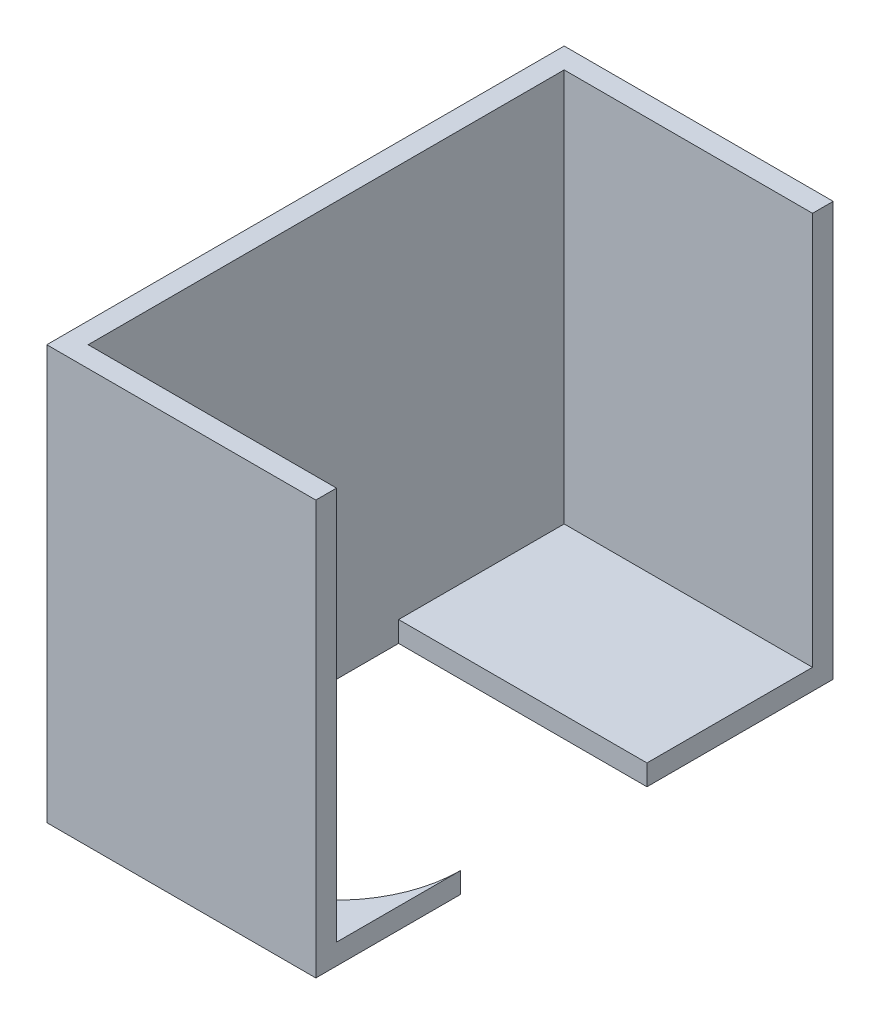
ISO-10303-21;
HEADER;
FILE_DESCRIPTION(('STEP AP214'),'2;1');
FILE_NAME('part.step','',(''),(''),'','','');
FILE_SCHEMA(('AUTOMOTIVE_DESIGN { 1 0 10303 214 1 1 1 1 }'));
ENDSEC;
DATA;
#1=APPLICATION_CONTEXT('core data for automotive mechanical design processes');
#2=APPLICATION_PROTOCOL_DEFINITION('international standard','automotive_design',2000,#1);
#3=PRODUCT_CONTEXT('',#1,'mechanical');
#4=PRODUCT('Part','Part','',(#3));
#5=PRODUCT_RELATED_PRODUCT_CATEGORY('part','',(#4));
#6=PRODUCT_DEFINITION_FORMATION('','',#4);
#7=PRODUCT_DEFINITION_CONTEXT('part definition',#1,'design');
#8=PRODUCT_DEFINITION('design','',#6,#7);
#9=PRODUCT_DEFINITION_SHAPE('','',#8);
#10=(LENGTH_UNIT() NAMED_UNIT(*) SI_UNIT(.MILLI.,.METRE.));
#11=(NAMED_UNIT(*) PLANE_ANGLE_UNIT() SI_UNIT($,.RADIAN.));
#12=(NAMED_UNIT(*) SI_UNIT($,.STERADIAN.) SOLID_ANGLE_UNIT());
#13=UNCERTAINTY_MEASURE_WITH_UNIT(LENGTH_MEASURE(1.E-05),#10,'distance_accuracy_value','');
#14=(GEOMETRIC_REPRESENTATION_CONTEXT(3) GLOBAL_UNCERTAINTY_ASSIGNED_CONTEXT((#13)) GLOBAL_UNIT_ASSIGNED_CONTEXT((#10,
#11,#12)) REPRESENTATION_CONTEXT('',''));
#15=CARTESIAN_POINT('',(0.,0.,0.));
#16=DIRECTION('',(0.,0.,1.));
#17=DIRECTION('',(1.,0.,0.));
#18=AXIS2_PLACEMENT_3D('',#15,#16,#17);
#19=CARTESIAN_POINT('',(7.,20.,12.5));
#20=DIRECTION('',(-1.,0.,0.));
#21=DIRECTION('',(0.,0.,1.));
#22=AXIS2_PLACEMENT_3D('',#19,#20,#21);
#23=PLANE('',#22);
#24=DIRECTION('',(0.,-1.,0.));
#25=VECTOR('',#24,1.);
#26=CARTESIAN_POINT('',(7.,20.,-3.49999999999999));
#27=LINE('',#26,#25);
#28=CARTESIAN_POINT('',(7.,1.,-3.49999999999999));
#29=VERTEX_POINT('',#28);
#30=CARTESIAN_POINT('',(7.,0.,-3.49999999999999));
#31=VERTEX_POINT('',#30);
#32=EDGE_CURVE('E48',#29,#31,#27,.T.);
#33=ORIENTED_EDGE('',*,*,#32,.T.);
#34=DIRECTION('',(0.,0.,-1.));
#35=VECTOR('',#34,1.);
#36=CARTESIAN_POINT('',(7.,0.,12.5));
#37=LINE('',#36,#35);
#38=CARTESIAN_POINT('',(7.,0.,-12.5));
#39=VERTEX_POINT('',#38);
#40=EDGE_CURVE('E184',#31,#39,#37,.T.);
#41=ORIENTED_EDGE('',*,*,#40,.T.);
#42=DIRECTION('',(0.,-1.,0.));
#43=VECTOR('',#42,1.);
#44=CARTESIAN_POINT('',(7.,20.,-12.5));
#45=LINE('',#44,#43);
#46=CARTESIAN_POINT('',(7.,20.,-12.5));
#47=VERTEX_POINT('',#46);
#48=EDGE_CURVE('E212',#47,#39,#45,.T.);
#49=ORIENTED_EDGE('',*,*,#48,.F.);
#50=DIRECTION('',(0.,0.,-1.));
#51=VECTOR('',#50,1.);
#52=CARTESIAN_POINT('',(7.,20.,12.5));
#53=LINE('',#52,#51);
#54=CARTESIAN_POINT('',(7.,20.,-11.5));
#55=VERTEX_POINT('',#54);
#56=EDGE_CURVE('E189',#55,#47,#53,.T.);
#57=ORIENTED_EDGE('',*,*,#56,.F.);
#58=DIRECTION('',(0.,-1.,0.));
#59=VECTOR('',#58,1.);
#60=CARTESIAN_POINT('',(7.,20.,-11.5));
#61=LINE('',#60,#59);
#62=CARTESIAN_POINT('',(7.,1.,-11.5));
#63=VERTEX_POINT('',#62);
#64=EDGE_CURVE('E56',#55,#63,#61,.T.);
#65=ORIENTED_EDGE('',*,*,#64,.T.);
#66=DIRECTION('',(0.,0.,-1.));
#67=VECTOR('',#66,1.);
#68=CARTESIAN_POINT('',(7.,1.,-11.5));
#69=LINE('',#68,#67);
#70=EDGE_CURVE('E171',#29,#63,#69,.T.);
#71=ORIENTED_EDGE('',*,*,#70,.F.);
#72=EDGE_LOOP('',(#33,#41,#49,#57,#65,#71));
#73=FACE_BOUND('',#72,.T.);
#74=ADVANCED_FACE('F33',(#73),#23,.F.);
#75=CARTESIAN_POINT('',(0.,0.,0.));
#76=DIRECTION('',(0.,-1.,0.));
#77=DIRECTION('',(0.,0.,-1.));
#78=AXIS2_PLACEMENT_3D('',#75,#76,#77);
#79=PLANE('',#78);
#80=DIRECTION('',(0.,0.,1.));
#81=VECTOR('',#80,1.);
#82=CARTESIAN_POINT('',(-5.,0.,-3.49999999999999));
#83=LINE('',#82,#81);
#84=CARTESIAN_POINT('',(-5.,0.,-3.49999999999999));
#85=VERTEX_POINT('',#84);
#86=CARTESIAN_POINT('',(-5.,0.,5.50000000000001));
#87=VERTEX_POINT('',#86);
#88=EDGE_CURVE('E131',#85,#87,#83,.T.);
#89=ORIENTED_EDGE('',*,*,#88,.T.);
#90=CARTESIAN_POINT('',(1.,0.,5.50000000000001));
#91=DIRECTION('',(0.,1.,0.));
#92=DIRECTION('',(0.,0.,1.));
#93=AXIS2_PLACEMENT_3D('',#90,#91,#92);
#94=CIRCLE('',#93,6.);
#95=CARTESIAN_POINT('',(7.,0.,5.50000000000001));
#96=VERTEX_POINT('',#95);
#97=EDGE_CURVE('E139',#87,#96,#94,.T.);
#98=ORIENTED_EDGE('',*,*,#97,.T.);
#99=CARTESIAN_POINT('',(7.,0.,12.5));
#100=VERTEX_POINT('',#99);
#101=EDGE_CURVE('E196',#100,#96,#37,.T.);
#102=ORIENTED_EDGE('',*,*,#101,.F.);
#103=DIRECTION('',(1.,0.,0.));
#104=VECTOR('',#103,1.);
#105=CARTESIAN_POINT('',(-6.,0.,12.5));
#106=LINE('',#105,#104);
#107=CARTESIAN_POINT('',(-6.,0.,12.5));
#108=VERTEX_POINT('',#107);
#109=EDGE_CURVE('E202',#108,#100,#106,.T.);
#110=ORIENTED_EDGE('',*,*,#109,.F.);
#111=DIRECTION('',(0.,0.,1.));
#112=VECTOR('',#111,1.);
#113=CARTESIAN_POINT('',(-6.,0.,12.5));
#114=LINE('',#113,#112);
#115=CARTESIAN_POINT('',(-6.,0.,-12.5));
#116=VERTEX_POINT('',#115);
#117=EDGE_CURVE('E200',#116,#108,#114,.T.);
#118=ORIENTED_EDGE('',*,*,#117,.F.);
#119=DIRECTION('',(-1.,0.,0.));
#120=VECTOR('',#119,1.);
#121=CARTESIAN_POINT('',(-6.,0.,-12.5));
#122=LINE('',#121,#120);
#123=EDGE_CURVE('E198',#39,#116,#122,.T.);
#124=ORIENTED_EDGE('',*,*,#123,.F.);
#125=ORIENTED_EDGE('',*,*,#40,.F.);
#126=DIRECTION('',(-1.,0.,0.));
#127=VECTOR('',#126,1.);
#128=CARTESIAN_POINT('',(-5.,0.,-3.49999999999999));
#129=LINE('',#128,#127);
#130=EDGE_CURVE('E145',#31,#85,#129,.T.);
#131=ORIENTED_EDGE('',*,*,#130,.T.);
#132=EDGE_LOOP('',(#89,#98,#102,#110,#118,#124,#125,#131));
#133=FACE_BOUND('',#132,.T.);
#134=ADVANCED_FACE('F147',(#133),#79,.T.);
#135=CARTESIAN_POINT('',(0.,1.,0.));
#136=DIRECTION('',(0.,1.,0.));
#137=DIRECTION('',(0.,0.,1.));
#138=AXIS2_PLACEMENT_3D('',#135,#136,#137);
#139=PLANE('',#138);
#140=DIRECTION('',(1.,0.,0.));
#141=VECTOR('',#140,1.);
#142=CARTESIAN_POINT('',(-4.99999999999999,1.,11.5));
#143=LINE('',#142,#141);
#144=CARTESIAN_POINT('',(-4.99999999999999,1.,11.5));
#145=VERTEX_POINT('',#144);
#146=CARTESIAN_POINT('',(1.,1.,11.5));
#147=VERTEX_POINT('',#146);
#148=EDGE_CURVE('E168',#145,#147,#143,.T.);
#149=ORIENTED_EDGE('',*,*,#148,.T.);
#150=CARTESIAN_POINT('',(1.,1.,5.50000000000001));
#151=DIRECTION('',(0.,1.,0.));
#152=DIRECTION('',(0.,0.,1.));
#153=AXIS2_PLACEMENT_3D('',#150,#151,#152);
#154=CIRCLE('',#153,6.);
#155=CARTESIAN_POINT('',(-5.,1.,5.50000000000001));
#156=VERTEX_POINT('',#155);
#157=EDGE_CURVE('E11',#147,#156,#154,.F.);
#158=ORIENTED_EDGE('',*,*,#157,.T.);
#159=DIRECTION('',(0.,0.,1.));
#160=VECTOR('',#159,1.);
#161=CARTESIAN_POINT('',(-5.,1.,-11.5));
#162=LINE('',#161,#160);
#163=EDGE_CURVE('E134',#156,#145,#162,.T.);
#164=ORIENTED_EDGE('',*,*,#163,.T.);
#165=EDGE_LOOP('',(#149,#158,#164));
#166=FACE_BOUND('',#165,.T.);
#167=ADVANCED_FACE('F228',(#166),#139,.T.);
#168=CARTESIAN_POINT('',(7.00000000000001,1.,11.5));
#169=VERTEX_POINT('',#168);
#170=CARTESIAN_POINT('',(7.,1.,5.50000000000001));
#171=VERTEX_POINT('',#170);
#172=EDGE_CURVE('E172',#169,#171,#69,.T.);
#173=ORIENTED_EDGE('',*,*,#172,.T.);
#174=EDGE_CURVE('E37',#171,#147,#154,.F.);
#175=ORIENTED_EDGE('',*,*,#174,.T.);
#176=EDGE_CURVE('E167',#147,#169,#143,.T.);
#177=ORIENTED_EDGE('',*,*,#176,.T.);
#178=EDGE_LOOP('',(#173,#175,#177));
#179=FACE_BOUND('',#178,.T.);
#180=ADVANCED_FACE('F220',(#179),#139,.T.);
#181=CARTESIAN_POINT('',(-5.,1.,-11.5));
#182=VERTEX_POINT('',#181);
#183=CARTESIAN_POINT('',(-5.,1.,-3.49999999999999));
#184=VERTEX_POINT('',#183);
#185=EDGE_CURVE('E164',#182,#184,#162,.T.);
#186=ORIENTED_EDGE('',*,*,#185,.T.);
#187=DIRECTION('',(1.,0.,0.));
#188=VECTOR('',#187,1.);
#189=CARTESIAN_POINT('',(0.,1.,-3.49999999999999));
#190=LINE('',#189,#188);
#191=EDGE_CURVE('E214',#184,#29,#190,.T.);
#192=ORIENTED_EDGE('',*,*,#191,.T.);
#193=ORIENTED_EDGE('',*,*,#70,.T.);
#194=DIRECTION('',(-1.,0.,0.));
#195=VECTOR('',#194,1.);
#196=CARTESIAN_POINT('',(-5.,1.,-11.5));
#197=LINE('',#196,#195);
#198=EDGE_CURVE('E159',#63,#182,#197,.T.);
#199=ORIENTED_EDGE('',*,*,#198,.T.);
#200=EDGE_LOOP('',(#186,#192,#193,#199));
#201=FACE_BOUND('',#200,.T.);
#202=ADVANCED_FACE('F231',(#201),#139,.T.);
#203=ORIENTED_EDGE('',*,*,#101,.T.);
#204=DIRECTION('',(0.,-1.,0.));
#205=VECTOR('',#204,1.);
#206=CARTESIAN_POINT('',(7.,20.,5.50000000000001));
#207=LINE('',#206,#205);
#208=EDGE_CURVE('E136',#171,#96,#207,.T.);
#209=ORIENTED_EDGE('',*,*,#208,.F.);
#210=ORIENTED_EDGE('',*,*,#172,.F.);
#211=DIRECTION('',(0.,-1.,0.));
#212=VECTOR('',#211,1.);
#213=CARTESIAN_POINT('',(7.00000000000001,20.,11.5));
#214=LINE('',#213,#212);
#215=CARTESIAN_POINT('',(7.00000000000001,20.,11.5));
#216=VERTEX_POINT('',#215);
#217=EDGE_CURVE('E179',#216,#169,#214,.T.);
#218=ORIENTED_EDGE('',*,*,#217,.F.);
#219=CARTESIAN_POINT('',(7.,20.,12.5));
#220=VERTEX_POINT('',#219);
#221=EDGE_CURVE('E185',#220,#216,#53,.T.);
#222=ORIENTED_EDGE('',*,*,#221,.F.);
#223=DIRECTION('',(0.,-1.,0.));
#224=VECTOR('',#223,1.);
#225=CARTESIAN_POINT('',(7.,20.,12.5));
#226=LINE('',#225,#224);
#227=EDGE_CURVE('E195',#220,#100,#226,.T.);
#228=ORIENTED_EDGE('',*,*,#227,.T.);
#229=EDGE_LOOP('',(#203,#209,#210,#218,#222,#228));
#230=FACE_BOUND('',#229,.T.);
#231=ADVANCED_FACE('F35',(#230),#23,.F.);
#232=CARTESIAN_POINT('',(0.,20.,0.));
#233=DIRECTION('',(0.,-1.,0.));
#234=DIRECTION('',(0.,0.,-1.));
#235=AXIS2_PLACEMENT_3D('',#232,#233,#234);
#236=PLANE('',#235);
#237=DIRECTION('',(1.,0.,0.));
#238=VECTOR('',#237,1.);
#239=CARTESIAN_POINT('',(-4.99999999999999,20.,11.5));
#240=LINE('',#239,#238);
#241=CARTESIAN_POINT('',(-4.99999999999999,20.,11.5));
#242=VERTEX_POINT('',#241);
#243=EDGE_CURVE('E158',#242,#216,#240,.T.);
#244=ORIENTED_EDGE('',*,*,#243,.F.);
#245=DIRECTION('',(0.,0.,1.));
#246=VECTOR('',#245,1.);
#247=CARTESIAN_POINT('',(-5.,20.,-11.5));
#248=LINE('',#247,#246);
#249=CARTESIAN_POINT('',(-5.,20.,-11.5));
#250=VERTEX_POINT('',#249);
#251=EDGE_CURVE('E156',#250,#242,#248,.T.);
#252=ORIENTED_EDGE('',*,*,#251,.F.);
#253=DIRECTION('',(-1.,0.,0.));
#254=VECTOR('',#253,1.);
#255=CARTESIAN_POINT('',(-5.,20.,-11.5));
#256=LINE('',#255,#254);
#257=EDGE_CURVE('E161',#55,#250,#256,.T.);
#258=ORIENTED_EDGE('',*,*,#257,.F.);
#259=ORIENTED_EDGE('',*,*,#56,.T.);
#260=DIRECTION('',(-1.,0.,0.));
#261=VECTOR('',#260,1.);
#262=CARTESIAN_POINT('',(-6.,20.,-12.5));
#263=LINE('',#262,#261);
#264=CARTESIAN_POINT('',(-6.,20.,-12.5));
#265=VERTEX_POINT('',#264);
#266=EDGE_CURVE('E188',#47,#265,#263,.T.);
#267=ORIENTED_EDGE('',*,*,#266,.T.);
#268=DIRECTION('',(0.,0.,1.));
#269=VECTOR('',#268,1.);
#270=CARTESIAN_POINT('',(-6.,20.,12.5));
#271=LINE('',#270,#269);
#272=CARTESIAN_POINT('',(-6.,20.,12.5));
#273=VERTEX_POINT('',#272);
#274=EDGE_CURVE('E191',#265,#273,#271,.T.);
#275=ORIENTED_EDGE('',*,*,#274,.T.);
#276=DIRECTION('',(1.,0.,0.));
#277=VECTOR('',#276,1.);
#278=CARTESIAN_POINT('',(-6.,20.,12.5));
#279=LINE('',#278,#277);
#280=EDGE_CURVE('E193',#273,#220,#279,.T.);
#281=ORIENTED_EDGE('',*,*,#280,.T.);
#282=ORIENTED_EDGE('',*,*,#221,.T.);
#283=EDGE_LOOP('',(#244,#252,#258,#259,#267,#275,#281,#282));
#284=FACE_BOUND('',#283,.T.);
#285=ADVANCED_FACE('F245',(#284),#236,.F.);
#286=CARTESIAN_POINT('',(-6.,20.,-12.5));
#287=DIRECTION('',(0.,0.,1.));
#288=DIRECTION('',(1.,0.,0.));
#289=AXIS2_PLACEMENT_3D('',#286,#287,#288);
#290=PLANE('',#289);
#291=ORIENTED_EDGE('',*,*,#123,.T.);
#292=DIRECTION('',(0.,-1.,0.));
#293=VECTOR('',#292,1.);
#294=CARTESIAN_POINT('',(-6.,20.,-12.5));
#295=LINE('',#294,#293);
#296=EDGE_CURVE('E209',#265,#116,#295,.T.);
#297=ORIENTED_EDGE('',*,*,#296,.F.);
#298=ORIENTED_EDGE('',*,*,#266,.F.);
#299=ORIENTED_EDGE('',*,*,#48,.T.);
#300=EDGE_LOOP('',(#291,#297,#298,#299));
#301=FACE_BOUND('',#300,.T.);
#302=ADVANCED_FACE('F250',(#301),#290,.F.);
#303=CARTESIAN_POINT('',(-6.,20.,12.5));
#304=DIRECTION('',(1.,0.,0.));
#305=DIRECTION('',(0.,0.,-1.));
#306=AXIS2_PLACEMENT_3D('',#303,#304,#305);
#307=PLANE('',#306);
#308=ORIENTED_EDGE('',*,*,#117,.T.);
#309=DIRECTION('',(0.,-1.,0.));
#310=VECTOR('',#309,1.);
#311=CARTESIAN_POINT('',(-6.,20.,12.5));
#312=LINE('',#311,#310);
#313=EDGE_CURVE('E206',#273,#108,#312,.T.);
#314=ORIENTED_EDGE('',*,*,#313,.F.);
#315=ORIENTED_EDGE('',*,*,#274,.F.);
#316=ORIENTED_EDGE('',*,*,#296,.T.);
#317=EDGE_LOOP('',(#308,#314,#315,#316));
#318=FACE_BOUND('',#317,.T.);
#319=ADVANCED_FACE('F264',(#318),#307,.F.);
#320=CARTESIAN_POINT('',(-6.,20.,12.5));
#321=DIRECTION('',(0.,0.,-1.));
#322=DIRECTION('',(-1.,0.,0.));
#323=AXIS2_PLACEMENT_3D('',#320,#321,#322);
#324=PLANE('',#323);
#325=ORIENTED_EDGE('',*,*,#109,.T.);
#326=ORIENTED_EDGE('',*,*,#227,.F.);
#327=ORIENTED_EDGE('',*,*,#280,.F.);
#328=ORIENTED_EDGE('',*,*,#313,.T.);
#329=EDGE_LOOP('',(#325,#326,#327,#328));
#330=FACE_BOUND('',#329,.T.);
#331=ADVANCED_FACE('F259',(#330),#324,.F.);
#332=CARTESIAN_POINT('',(-5.,20.,-11.5));
#333=DIRECTION('',(1.,0.,0.));
#334=DIRECTION('',(0.,0.,-1.));
#335=AXIS2_PLACEMENT_3D('',#332,#333,#334);
#336=PLANE('',#335);
#337=ORIENTED_EDGE('',*,*,#251,.T.);
#338=DIRECTION('',(0.,-1.,0.));
#339=VECTOR('',#338,1.);
#340=CARTESIAN_POINT('',(-4.99999999999999,20.,11.5));
#341=LINE('',#340,#339);
#342=EDGE_CURVE('E182',#242,#145,#341,.T.);
#343=ORIENTED_EDGE('',*,*,#342,.T.);
#344=ORIENTED_EDGE('',*,*,#163,.F.);
#345=DIRECTION('',(0.,-1.,0.));
#346=VECTOR('',#345,1.);
#347=CARTESIAN_POINT('',(-5.,20.,5.50000000000001));
#348=LINE('',#347,#346);
#349=EDGE_CURVE('E126',#156,#87,#348,.T.);
#350=ORIENTED_EDGE('',*,*,#349,.T.);
#351=ORIENTED_EDGE('',*,*,#88,.F.);
#352=DIRECTION('',(0.,-1.,0.));
#353=VECTOR('',#352,1.);
#354=CARTESIAN_POINT('',(-5.,20.,-3.49999999999999));
#355=LINE('',#354,#353);
#356=EDGE_CURVE('E152',#184,#85,#355,.T.);
#357=ORIENTED_EDGE('',*,*,#356,.F.);
#358=ORIENTED_EDGE('',*,*,#185,.F.);
#359=DIRECTION('',(0.,-1.,0.));
#360=VECTOR('',#359,1.);
#361=CARTESIAN_POINT('',(-5.,20.,-11.5));
#362=LINE('',#361,#360);
#363=EDGE_CURVE('E163',#250,#182,#362,.T.);
#364=ORIENTED_EDGE('',*,*,#363,.F.);
#365=EDGE_LOOP('',(#337,#343,#344,#350,#351,#357,#358,#364));
#366=FACE_BOUND('',#365,.T.);
#367=ADVANCED_FACE('F128',(#366),#336,.T.);
#368=CARTESIAN_POINT('',(-4.99999999999999,20.,11.5));
#369=DIRECTION('',(0.,0.,-1.));
#370=DIRECTION('',(-1.,0.,0.));
#371=AXIS2_PLACEMENT_3D('',#368,#369,#370);
#372=PLANE('',#371);
#373=ORIENTED_EDGE('',*,*,#243,.T.);
#374=ORIENTED_EDGE('',*,*,#217,.T.);
#375=ORIENTED_EDGE('',*,*,#176,.F.);
#376=ORIENTED_EDGE('',*,*,#148,.F.);
#377=ORIENTED_EDGE('',*,*,#342,.F.);
#378=EDGE_LOOP('',(#373,#374,#375,#376,#377));
#379=FACE_BOUND('',#378,.T.);
#380=ADVANCED_FACE('F224',(#379),#372,.T.);
#381=CARTESIAN_POINT('',(-5.,20.,-11.5));
#382=DIRECTION('',(0.,0.,1.));
#383=DIRECTION('',(1.,0.,0.));
#384=AXIS2_PLACEMENT_3D('',#381,#382,#383);
#385=PLANE('',#384);
#386=ORIENTED_EDGE('',*,*,#198,.F.);
#387=ORIENTED_EDGE('',*,*,#64,.F.);
#388=ORIENTED_EDGE('',*,*,#257,.T.);
#389=ORIENTED_EDGE('',*,*,#363,.T.);
#390=EDGE_LOOP('',(#386,#387,#388,#389));
#391=FACE_BOUND('',#390,.T.);
#392=ADVANCED_FACE('F270',(#391),#385,.T.);
#393=CARTESIAN_POINT('',(1.,20.,5.50000000000001));
#394=DIRECTION('',(0.,-1.,0.));
#395=DIRECTION('',(0.,0.,-1.));
#396=AXIS2_PLACEMENT_3D('',#393,#394,#395);
#397=CYLINDRICAL_SURFACE('',#396,6.);
#398=ORIENTED_EDGE('',*,*,#174,.F.);
#399=ORIENTED_EDGE('',*,*,#208,.T.);
#400=ORIENTED_EDGE('',*,*,#97,.F.);
#401=ORIENTED_EDGE('',*,*,#349,.F.);
#402=ORIENTED_EDGE('',*,*,#157,.F.);
#403=EDGE_LOOP('',(#398,#399,#400,#401,#402));
#404=FACE_BOUND('',#403,.T.);
#405=ADVANCED_FACE('F140',(#404),#397,.F.);
#406=CARTESIAN_POINT('',(-5.,20.,-3.49999999999999));
#407=DIRECTION('',(0.,0.,1.));
#408=DIRECTION('',(1.,0.,0.));
#409=AXIS2_PLACEMENT_3D('',#406,#407,#408);
#410=PLANE('',#409);
#411=ORIENTED_EDGE('',*,*,#356,.T.);
#412=ORIENTED_EDGE('',*,*,#130,.F.);
#413=ORIENTED_EDGE('',*,*,#32,.F.);
#414=ORIENTED_EDGE('',*,*,#191,.F.);
#415=EDGE_LOOP('',(#411,#412,#413,#414));
#416=FACE_BOUND('',#415,.T.);
#417=ADVANCED_FACE('F274',(#416),#410,.T.);
#418=CLOSED_SHELL('',(#74,#134,#167,#180,#202,#231,#285,#302,#319,#331,#367,#380,#392,#405,#417));
#419=MANIFOLD_SOLID_BREP('B2',#418);
#420=ADVANCED_BREP_SHAPE_REPRESENTATION('',(#18,#419),#14);
#421=SHAPE_DEFINITION_REPRESENTATION(#9,#420);
ENDSEC;
END-ISO-10303-21;
